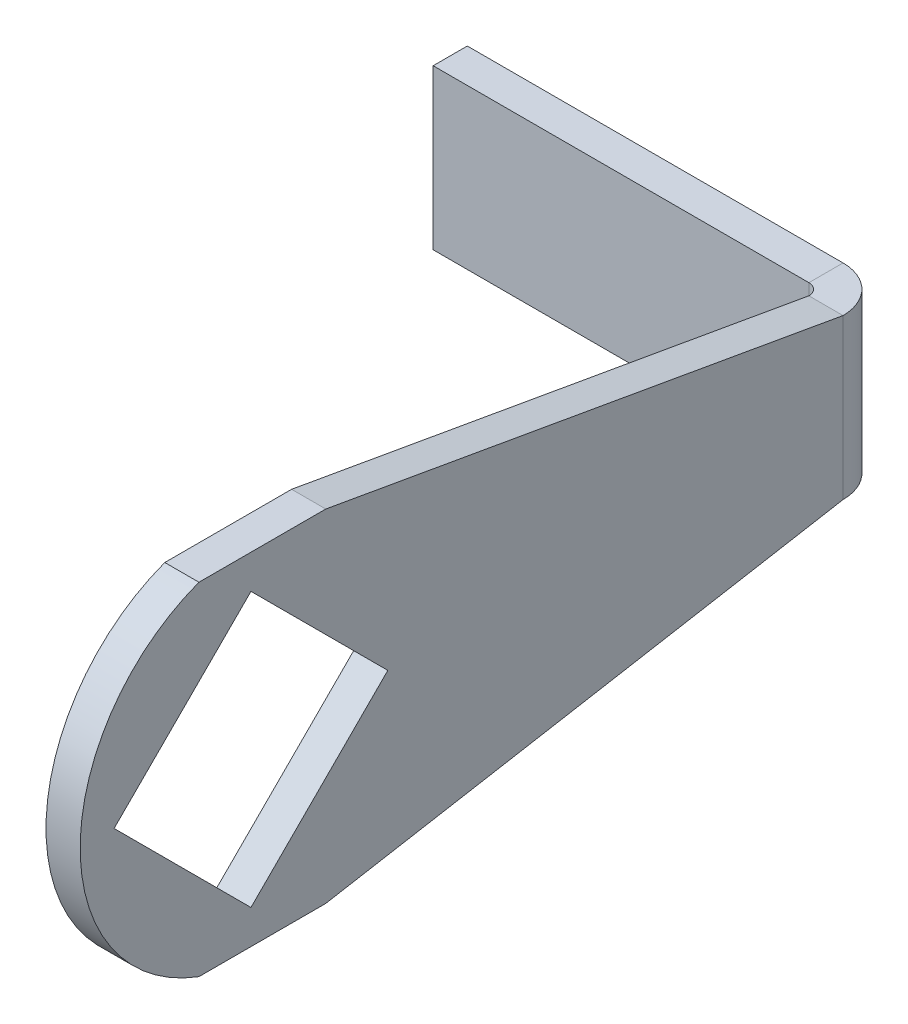
ISO-10303-21;
HEADER;
FILE_DESCRIPTION(('STEP AP214'),'2;1');
FILE_NAME('part.step','',(''),(''),'','','');
FILE_SCHEMA(('AUTOMOTIVE_DESIGN { 1 0 10303 214 1 1 1 1 }'));
ENDSEC;
DATA;
#1=APPLICATION_CONTEXT('core data for automotive mechanical design processes');
#2=APPLICATION_PROTOCOL_DEFINITION('international standard','automotive_design',2000,#1);
#3=PRODUCT_CONTEXT('',#1,'mechanical');
#4=PRODUCT('Part','Part','',(#3));
#5=PRODUCT_RELATED_PRODUCT_CATEGORY('part','',(#4));
#6=PRODUCT_DEFINITION_FORMATION('','',#4);
#7=PRODUCT_DEFINITION_CONTEXT('part definition',#1,'design');
#8=PRODUCT_DEFINITION('design','',#6,#7);
#9=PRODUCT_DEFINITION_SHAPE('','',#8);
#10=(LENGTH_UNIT() NAMED_UNIT(*) SI_UNIT(.MILLI.,.METRE.));
#11=(NAMED_UNIT(*) PLANE_ANGLE_UNIT() SI_UNIT($,.RADIAN.));
#12=(NAMED_UNIT(*) SI_UNIT($,.STERADIAN.) SOLID_ANGLE_UNIT());
#13=UNCERTAINTY_MEASURE_WITH_UNIT(LENGTH_MEASURE(1.E-05),#10,'distance_accuracy_value','');
#14=(GEOMETRIC_REPRESENTATION_CONTEXT(3) GLOBAL_UNCERTAINTY_ASSIGNED_CONTEXT((#13)) GLOBAL_UNIT_ASSIGNED_CONTEXT((#10,
#11,#12)) REPRESENTATION_CONTEXT('',''));
#15=CARTESIAN_POINT('',(0.,0.,0.));
#16=DIRECTION('',(0.,0.,1.));
#17=DIRECTION('',(1.,0.,0.));
#18=AXIS2_PLACEMENT_3D('',#15,#16,#17);
#19=CARTESIAN_POINT('',(9.99999999999999,7.50000000000001,1.49999999999999));
#20=DIRECTION('',(1.,0.,0.));
#21=DIRECTION('',(0.,0.,-1.));
#22=AXIS2_PLACEMENT_3D('',#19,#20,#21);
#23=PLANE('',#22);
#24=DIRECTION('',(0.,-0.70710678118654,0.707106781186555));
#25=VECTOR('',#24,1.);
#26=CARTESIAN_POINT('',(10.,20.0052038200427,14.0052038200424));
#27=LINE('',#26,#25);
#28=CARTESIAN_POINT('',(10.0000000000001,6.01040764008559,27.9999999999999));
#29=VERTEX_POINT('',#28);
#30=CARTESIAN_POINT('',(10.0000000000001,0.,34.0104076400856));
#31=VERTEX_POINT('',#30);
#32=EDGE_CURVE('E182',#29,#31,#27,.T.);
#33=ORIENTED_EDGE('',*,*,#32,.F.);
#34=DIRECTION('',(0.,0.707106781186544,0.707106781186551));
#35=VECTOR('',#34,1.);
#36=CARTESIAN_POINT('',(10.,-6.49479617995714,15.494796179957));
#37=LINE('',#36,#35);
#38=CARTESIAN_POINT('',(10.0000000000001,0.,21.9895923599142));
#39=VERTEX_POINT('',#38);
#40=EDGE_CURVE('E189',#39,#29,#37,.T.);
#41=ORIENTED_EDGE('',*,*,#40,.F.);
#42=DIRECTION('',(0.,0.707106781186544,-0.707106781186551));
#43=VECTOR('',#42,1.);
#44=CARTESIAN_POINT('',(10.,13.9947961799571,7.99479617995699));
#45=LINE('',#44,#43);
#46=CARTESIAN_POINT('',(10.0000000000001,-6.01040764008559,27.9999999999999));
#47=VERTEX_POINT('',#46);
#48=EDGE_CURVE('E186',#47,#39,#45,.T.);
#49=ORIENTED_EDGE('',*,*,#48,.F.);
#50=DIRECTION('',(0.,-0.70710678118654,-0.707106781186555));
#51=VECTOR('',#50,1.);
#52=CARTESIAN_POINT('',(10.0000000000001,-12.5052038200429,21.5052038200424));
#53=LINE('',#52,#51);
#54=EDGE_CURVE('E184',#31,#47,#53,.T.);
#55=ORIENTED_EDGE('',*,*,#54,.F.);
#56=EDGE_LOOP('',(#33,#41,#49,#55));
#57=FACE_BOUND('',#56,.T.);
#58=DIRECTION('',(0.,0.,1.));
#59=VECTOR('',#58,1.);
#60=CARTESIAN_POINT('',(10.0000000000001,-7.5,35.5));
#61=LINE('',#60,#59);
#62=CARTESIAN_POINT('',(10.0000000000001,-7.50000000000003,24.7161178185853));
#63=VERTEX_POINT('',#62);
#64=CARTESIAN_POINT('',(10.0000000000001,-7.5,30.2838821814149));
#65=VERTEX_POINT('',#64);
#66=EDGE_CURVE('E171',#63,#65,#61,.T.);
#67=ORIENTED_EDGE('',*,*,#66,.F.);
#68=DIRECTION('',(0.,0.1734184067972,-0.984848240179126));
#69=VECTOR('',#68,1.);
#70=CARTESIAN_POINT('',(9.99999999999999,-3.0837912116487,-0.363661968329762));
#71=LINE('',#70,#69);
#72=CARTESIAN_POINT('',(10.,-3.50000000000001,1.99999999999999));
#73=VERTEX_POINT('',#72);
#74=EDGE_CURVE('E153',#63,#73,#71,.T.);
#75=ORIENTED_EDGE('',*,*,#74,.T.);
#76=DIRECTION('',(0.,1.,0.));
#77=VECTOR('',#76,1.);
#78=CARTESIAN_POINT('',(10.,7.50000000000001,1.99999999999999));
#79=LINE('',#78,#77);
#80=CARTESIAN_POINT('',(10.,3.50000000000001,1.99999999999999));
#81=VERTEX_POINT('',#80);
#82=EDGE_CURVE('E177',#73,#81,#79,.T.);
#83=ORIENTED_EDGE('',*,*,#82,.T.);
#84=DIRECTION('',(0.,0.1734184067972,0.984848240179126));
#85=VECTOR('',#84,1.);
#86=CARTESIAN_POINT('',(10.,3.53490036888989,2.19820022290359));
#87=LINE('',#86,#85);
#88=CARTESIAN_POINT('',(10.0000000000001,7.5,24.7161178185849));
#89=VERTEX_POINT('',#88);
#90=EDGE_CURVE('E217',#81,#89,#87,.T.);
#91=ORIENTED_EDGE('',*,*,#90,.T.);
#92=DIRECTION('',(0.,0.,-1.));
#93=VECTOR('',#92,1.);
#94=CARTESIAN_POINT('',(9.99999999999999,7.50000000000001,1.49999999999999));
#95=LINE('',#94,#93);
#96=CARTESIAN_POINT('',(10.0000000000001,7.5,30.2838821814149));
#97=VERTEX_POINT('',#96);
#98=EDGE_CURVE('E167',#97,#89,#95,.T.);
#99=ORIENTED_EDGE('',*,*,#98,.F.);
#100=CARTESIAN_POINT('',(10.0000000000001,0.,27.4999999999999));
#101=DIRECTION('',(1.,0.,0.));
#102=DIRECTION('',(0.,0.,-1.));
#103=AXIS2_PLACEMENT_3D('',#100,#101,#102);
#104=CIRCLE('',#103,8.);
#105=EDGE_CURVE('E240',#97,#65,#104,.T.);
#106=ORIENTED_EDGE('',*,*,#105,.T.);
#107=EDGE_LOOP('',(#67,#75,#83,#91,#99,#106));
#108=FACE_BOUND('',#107,.T.);
#109=ADVANCED_FACE('F37',(#57,#108),#23,.T.);
#110=CARTESIAN_POINT('',(8.49999999999999,7.50000000000001,1.5));
#111=DIRECTION('',(1.,0.,0.));
#112=DIRECTION('',(0.,0.,-1.));
#113=AXIS2_PLACEMENT_3D('',#110,#111,#112);
#114=PLANE('',#113);
#115=DIRECTION('',(0.,-0.707106781186544,-0.707106781186551));
#116=VECTOR('',#115,1.);
#117=CARTESIAN_POINT('',(8.50000000000009,6.01040764008559,27.9999999999999));
#118=LINE('',#117,#116);
#119=CARTESIAN_POINT('',(8.50000000000009,6.01040764008559,27.9999999999998));
#120=VERTEX_POINT('',#119);
#121=CARTESIAN_POINT('',(8.50000000000006,0.,21.9895923599142));
#122=VERTEX_POINT('',#121);
#123=EDGE_CURVE('E206',#120,#122,#118,.T.);
#124=ORIENTED_EDGE('',*,*,#123,.F.);
#125=DIRECTION('',(0.,0.70710678118654,-0.707106781186555));
#126=VECTOR('',#125,1.);
#127=CARTESIAN_POINT('',(8.50000000000009,6.01040764008559,27.9999999999999));
#128=LINE('',#127,#126);
#129=CARTESIAN_POINT('',(8.50000000000011,0.,34.0104076400856));
#130=VERTEX_POINT('',#129);
#131=EDGE_CURVE('E209',#130,#120,#128,.T.);
#132=ORIENTED_EDGE('',*,*,#131,.F.);
#133=DIRECTION('',(0.,0.70710678118654,0.707106781186555));
#134=VECTOR('',#133,1.);
#135=CARTESIAN_POINT('',(8.50000000000009,-6.01040764008559,27.9999999999999));
#136=LINE('',#135,#134);
#137=CARTESIAN_POINT('',(8.50000000000009,-6.01040764008559,27.9999999999999));
#138=VERTEX_POINT('',#137);
#139=EDGE_CURVE('E196',#138,#130,#136,.T.);
#140=ORIENTED_EDGE('',*,*,#139,.F.);
#141=DIRECTION('',(0.,-0.707106781186544,0.707106781186551));
#142=VECTOR('',#141,1.);
#143=CARTESIAN_POINT('',(8.50000000000009,-6.01040764008559,27.9999999999999));
#144=LINE('',#143,#142);
#145=EDGE_CURVE('E203',#122,#138,#144,.T.);
#146=ORIENTED_EDGE('',*,*,#145,.F.);
#147=EDGE_LOOP('',(#124,#132,#140,#146));
#148=FACE_BOUND('',#147,.T.);
#149=DIRECTION('',(0.,0.1734184067972,-0.984848240179126));
#150=VECTOR('',#149,1.);
#151=CARTESIAN_POINT('',(8.49999999999999,-3.0837912116487,-0.363661968329757));
#152=LINE('',#151,#150);
#153=CARTESIAN_POINT('',(8.50000000000007,-7.50000000000003,24.7161178185853));
#154=VERTEX_POINT('',#153);
#155=CARTESIAN_POINT('',(8.5,-3.5,2.));
#156=VERTEX_POINT('',#155);
#157=EDGE_CURVE('E250',#154,#156,#152,.T.);
#158=ORIENTED_EDGE('',*,*,#157,.F.);
#159=DIRECTION('',(0.,0.,1.));
#160=VECTOR('',#159,1.);
#161=CARTESIAN_POINT('',(8.50000000000011,-7.5,35.5));
#162=LINE('',#161,#160);
#163=CARTESIAN_POINT('',(8.5000000000001,-7.5,30.283882181415));
#164=VERTEX_POINT('',#163);
#165=EDGE_CURVE('E176',#154,#164,#162,.T.);
#166=ORIENTED_EDGE('',*,*,#165,.T.);
#167=CARTESIAN_POINT('',(8.50000000000009,0.,27.4999999999999));
#168=DIRECTION('',(1.,0.,0.));
#169=DIRECTION('',(0.,0.,-1.));
#170=AXIS2_PLACEMENT_3D('',#167,#168,#169);
#171=CIRCLE('',#170,8.);
#172=CARTESIAN_POINT('',(8.50000000000009,7.5,30.2838821814149));
#173=VERTEX_POINT('',#172);
#174=EDGE_CURVE('E239',#173,#164,#171,.T.);
#175=ORIENTED_EDGE('',*,*,#174,.F.);
#176=DIRECTION('',(0.,0.,-1.));
#177=VECTOR('',#176,1.);
#178=CARTESIAN_POINT('',(8.49999999999999,7.50000000000001,1.5));
#179=LINE('',#178,#177);
#180=CARTESIAN_POINT('',(8.50000000000007,7.5,24.7161178185849));
#181=VERTEX_POINT('',#180);
#182=EDGE_CURVE('E174',#173,#181,#179,.T.);
#183=ORIENTED_EDGE('',*,*,#182,.T.);
#184=DIRECTION('',(0.,0.1734184067972,0.984848240179126));
#185=VECTOR('',#184,1.);
#186=CARTESIAN_POINT('',(8.5,3.53490036888989,2.1982002229036));
#187=LINE('',#186,#185);
#188=CARTESIAN_POINT('',(8.5,3.50000000000001,2.));
#189=VERTEX_POINT('',#188);
#190=EDGE_CURVE('E214',#189,#181,#187,.T.);
#191=ORIENTED_EDGE('',*,*,#190,.F.);
#192=DIRECTION('',(0.,1.,0.));
#193=VECTOR('',#192,1.);
#194=CARTESIAN_POINT('',(8.5,-7.5,2.));
#195=LINE('',#194,#193);
#196=EDGE_CURVE('E60',#156,#189,#195,.T.);
#197=ORIENTED_EDGE('',*,*,#196,.F.);
#198=EDGE_LOOP('',(#158,#166,#175,#183,#191,#197));
#199=FACE_BOUND('',#198,.T.);
#200=ADVANCED_FACE('F277',(#148,#199),#114,.F.);
#201=CARTESIAN_POINT('',(10.0000000000001,-7.5,35.5));
#202=DIRECTION('',(0.,-1.,0.));
#203=DIRECTION('',(0.,0.,-1.));
#204=AXIS2_PLACEMENT_3D('',#201,#202,#203);
#205=PLANE('',#204);
#206=ORIENTED_EDGE('',*,*,#165,.F.);
#207=DIRECTION('',(1.,0.,0.));
#208=VECTOR('',#207,1.);
#209=CARTESIAN_POINT('',(10.0000000000001,-7.50000000000003,24.7161178185853));
#210=LINE('',#209,#208);
#211=EDGE_CURVE('E248',#63,#154,#210,.F.);
#212=ORIENTED_EDGE('',*,*,#211,.F.);
#213=ORIENTED_EDGE('',*,*,#66,.T.);
#214=DIRECTION('',(1.,0.,0.));
#215=VECTOR('',#214,1.);
#216=CARTESIAN_POINT('',(10.0000000000001,-7.5,30.2838821814149));
#217=LINE('',#216,#215);
#218=EDGE_CURVE('E235',#65,#164,#217,.F.);
#219=ORIENTED_EDGE('',*,*,#218,.T.);
#220=EDGE_LOOP('',(#206,#212,#213,#219));
#221=FACE_BOUND('',#220,.T.);
#222=ADVANCED_FACE('F283',(#221),#205,.T.);
#223=CARTESIAN_POINT('',(-8.5,-7.5,1.5));
#224=DIRECTION('',(0.,0.,1.));
#225=DIRECTION('',(1.,0.,0.));
#226=AXIS2_PLACEMENT_3D('',#223,#224,#225);
#227=PLANE('',#226);
#228=DIRECTION('',(0.,-1.,0.));
#229=VECTOR('',#228,1.);
#230=CARTESIAN_POINT('',(-8.5,7.5,1.5));
#231=LINE('',#230,#229);
#232=CARTESIAN_POINT('',(-8.5,3.5,1.5));
#233=VERTEX_POINT('',#232);
#234=CARTESIAN_POINT('',(-8.5,-3.5,1.5));
#235=VERTEX_POINT('',#234);
#236=EDGE_CURVE('E11',#233,#235,#231,.T.);
#237=ORIENTED_EDGE('',*,*,#236,.T.);
#238=DIRECTION('',(1.,0.,0.));
#239=VECTOR('',#238,1.);
#240=CARTESIAN_POINT('',(-8.5,-3.5,1.5));
#241=LINE('',#240,#239);
#242=CARTESIAN_POINT('',(8.,-3.5,1.5));
#243=VERTEX_POINT('',#242);
#244=EDGE_CURVE('E150',#235,#243,#241,.T.);
#245=ORIENTED_EDGE('',*,*,#244,.T.);
#246=DIRECTION('',(0.,1.,0.));
#247=VECTOR('',#246,1.);
#248=CARTESIAN_POINT('',(8.,7.50000000000001,1.5));
#249=LINE('',#248,#247);
#250=CARTESIAN_POINT('',(8.,3.5,1.5));
#251=VERTEX_POINT('',#250);
#252=EDGE_CURVE('E160',#251,#243,#249,.F.);
#253=ORIENTED_EDGE('',*,*,#252,.F.);
#254=DIRECTION('',(-1.,0.,0.));
#255=VECTOR('',#254,1.);
#256=CARTESIAN_POINT('',(-8.5,3.5,1.5));
#257=LINE('',#256,#255);
#258=EDGE_CURVE('E229',#251,#233,#257,.T.);
#259=ORIENTED_EDGE('',*,*,#258,.T.);
#260=EDGE_LOOP('',(#237,#245,#253,#259));
#261=FACE_BOUND('',#260,.T.);
#262=ADVANCED_FACE('F158',(#261),#227,.T.);
#263=CARTESIAN_POINT('',(-8.5,-7.5,0.));
#264=DIRECTION('',(0.,0.,1.));
#265=DIRECTION('',(1.,0.,0.));
#266=AXIS2_PLACEMENT_3D('',#263,#264,#265);
#267=PLANE('',#266);
#268=DIRECTION('',(1.,0.,0.));
#269=VECTOR('',#268,1.);
#270=CARTESIAN_POINT('',(-45.5615862494977,-3.5,0.));
#271=LINE('',#270,#269);
#272=CARTESIAN_POINT('',(-8.5,-3.5,0.));
#273=VERTEX_POINT('',#272);
#274=CARTESIAN_POINT('',(8.,-3.5,0.));
#275=VERTEX_POINT('',#274);
#276=EDGE_CURVE('E144',#273,#275,#271,.T.);
#277=ORIENTED_EDGE('',*,*,#276,.F.);
#278=DIRECTION('',(0.,-1.,0.));
#279=VECTOR('',#278,1.);
#280=CARTESIAN_POINT('',(-8.5,7.5,0.));
#281=LINE('',#280,#279);
#282=CARTESIAN_POINT('',(-8.5,3.5,0.));
#283=VERTEX_POINT('',#282);
#284=EDGE_CURVE('E41',#283,#273,#281,.T.);
#285=ORIENTED_EDGE('',*,*,#284,.F.);
#286=DIRECTION('',(1.,0.,0.));
#287=VECTOR('',#286,1.);
#288=CARTESIAN_POINT('',(-8.5,3.5,0.));
#289=LINE('',#288,#287);
#290=CARTESIAN_POINT('',(8.,3.5,0.));
#291=VERTEX_POINT('',#290);
#292=EDGE_CURVE('E226',#291,#283,#289,.F.);
#293=ORIENTED_EDGE('',*,*,#292,.F.);
#294=DIRECTION('',(0.,1.,0.));
#295=VECTOR('',#294,1.);
#296=CARTESIAN_POINT('',(8.,7.50000000000001,0.));
#297=LINE('',#296,#295);
#298=EDGE_CURVE('E166',#291,#275,#297,.F.);
#299=ORIENTED_EDGE('',*,*,#298,.T.);
#300=EDGE_LOOP('',(#277,#285,#293,#299));
#301=FACE_BOUND('',#300,.T.);
#302=ADVANCED_FACE('F263',(#301),#267,.F.);
#303=CARTESIAN_POINT('',(-8.5,7.5,1.5));
#304=DIRECTION('',(1.,0.,0.));
#305=DIRECTION('',(0.,0.,-1.));
#306=AXIS2_PLACEMENT_3D('',#303,#304,#305);
#307=PLANE('',#306);
#308=DIRECTION('',(0.,0.,-1.));
#309=VECTOR('',#308,1.);
#310=CARTESIAN_POINT('',(-8.5,-3.5,0.));
#311=LINE('',#310,#309);
#312=EDGE_CURVE('E154',#273,#235,#311,.F.);
#313=ORIENTED_EDGE('',*,*,#312,.T.);
#314=ORIENTED_EDGE('',*,*,#236,.F.);
#315=DIRECTION('',(0.,0.,1.));
#316=VECTOR('',#315,1.);
#317=CARTESIAN_POINT('',(-8.5,3.5,1.5));
#318=LINE('',#317,#316);
#319=EDGE_CURVE('E220',#233,#283,#318,.F.);
#320=ORIENTED_EDGE('',*,*,#319,.T.);
#321=ORIENTED_EDGE('',*,*,#284,.T.);
#322=EDGE_LOOP('',(#313,#314,#320,#321));
#323=FACE_BOUND('',#322,.T.);
#324=ADVANCED_FACE('F39',(#323),#307,.F.);
#325=CARTESIAN_POINT('',(8.,7.50000000000001,2.));
#326=DIRECTION('',(0.,1.,0.));
#327=DIRECTION('',(1.,0.,0.));
#328=AXIS2_PLACEMENT_3D('',#325,#326,#327);
#329=CYLINDRICAL_SURFACE('',#328,2.);
#330=ORIENTED_EDGE('',*,*,#82,.F.);
#331=CARTESIAN_POINT('',(8.,-3.5,2.));
#332=DIRECTION('',(0.,-1.,0.));
#333=DIRECTION('',(0.,0.,-1.));
#334=AXIS2_PLACEMENT_3D('',#331,#332,#333);
#335=CIRCLE('',#334,2.);
#336=EDGE_CURVE('E145',#73,#275,#335,.F.);
#337=ORIENTED_EDGE('',*,*,#336,.T.);
#338=ORIENTED_EDGE('',*,*,#298,.F.);
#339=CARTESIAN_POINT('',(8.,3.5,2.));
#340=DIRECTION('',(0.,1.,0.));
#341=DIRECTION('',(0.,0.,1.));
#342=AXIS2_PLACEMENT_3D('',#339,#340,#341);
#343=CIRCLE('',#342,2.);
#344=EDGE_CURVE('E232',#291,#81,#343,.F.);
#345=ORIENTED_EDGE('',*,*,#344,.T.);
#346=EDGE_LOOP('',(#330,#337,#338,#345));
#347=FACE_BOUND('',#346,.T.);
#348=ADVANCED_FACE('F260',(#347),#329,.T.);
#349=CARTESIAN_POINT('',(8.,7.50000000000001,2.));
#350=DIRECTION('',(0.,1.,0.));
#351=DIRECTION('',(1.,0.,0.));
#352=AXIS2_PLACEMENT_3D('',#349,#350,#351);
#353=CYLINDRICAL_SURFACE('',#352,0.5);
#354=CARTESIAN_POINT('',(8.,-3.50000000000001,2.));
#355=DIRECTION('',(0.,1.,0.));
#356=DIRECTION('',(0.,0.,1.));
#357=AXIS2_PLACEMENT_3D('',#354,#355,#356);
#358=CIRCLE('',#357,0.5);
#359=EDGE_CURVE('E138',#156,#243,#358,.T.);
#360=ORIENTED_EDGE('',*,*,#359,.F.);
#361=ORIENTED_EDGE('',*,*,#196,.T.);
#362=CARTESIAN_POINT('',(8.,3.5,2.));
#363=DIRECTION('',(0.,1.,0.));
#364=DIRECTION('',(0.,0.,1.));
#365=AXIS2_PLACEMENT_3D('',#362,#363,#364);
#366=CIRCLE('',#365,0.5);
#367=EDGE_CURVE('E165',#251,#189,#366,.F.);
#368=ORIENTED_EDGE('',*,*,#367,.F.);
#369=ORIENTED_EDGE('',*,*,#252,.T.);
#370=EDGE_LOOP('',(#360,#361,#368,#369));
#371=FACE_BOUND('',#370,.T.);
#372=ADVANCED_FACE('F163',(#371),#353,.F.);
#373=CARTESIAN_POINT('',(9.99999999999999,7.50000000000001,1.49999999999999));
#374=DIRECTION('',(0.,1.,0.));
#375=DIRECTION('',(0.,0.,1.));
#376=AXIS2_PLACEMENT_3D('',#373,#374,#375);
#377=PLANE('',#376);
#378=ORIENTED_EDGE('',*,*,#182,.F.);
#379=DIRECTION('',(-1.,0.,0.));
#380=VECTOR('',#379,1.);
#381=CARTESIAN_POINT('',(8.50000000000009,7.5,30.2838821814149));
#382=LINE('',#381,#380);
#383=EDGE_CURVE('E243',#173,#97,#382,.F.);
#384=ORIENTED_EDGE('',*,*,#383,.T.);
#385=ORIENTED_EDGE('',*,*,#98,.T.);
#386=DIRECTION('',(1.,0.,0.));
#387=VECTOR('',#386,1.);
#388=CARTESIAN_POINT('',(10.0000000000001,7.5,24.7161178185849));
#389=LINE('',#388,#387);
#390=EDGE_CURVE('E211',#89,#181,#389,.F.);
#391=ORIENTED_EDGE('',*,*,#390,.T.);
#392=EDGE_LOOP('',(#378,#384,#385,#391));
#393=FACE_BOUND('',#392,.T.);
#394=ADVANCED_FACE('F292',(#393),#377,.T.);
#395=CARTESIAN_POINT('',(10.5000000000001,6.01040764008559,27.9999999999998));
#396=DIRECTION('',(0.,0.707106781186555,0.70710678118654));
#397=DIRECTION('',(0.,-0.70710678118654,0.707106781186555));
#398=AXIS2_PLACEMENT_3D('',#395,#396,#397);
#399=PLANE('',#398);
#400=ORIENTED_EDGE('',*,*,#32,.T.);
#401=DIRECTION('',(-1.,0.,0.));
#402=VECTOR('',#401,1.);
#403=CARTESIAN_POINT('',(10.5000000000001,0.,34.0104076400856));
#404=LINE('',#403,#402);
#405=EDGE_CURVE('E191',#31,#130,#404,.T.);
#406=ORIENTED_EDGE('',*,*,#405,.T.);
#407=ORIENTED_EDGE('',*,*,#131,.T.);
#408=DIRECTION('',(-1.,0.,0.));
#409=VECTOR('',#408,1.);
#410=CARTESIAN_POINT('',(10.5000000000001,6.01040764008559,27.9999999999998));
#411=LINE('',#410,#409);
#412=EDGE_CURVE('E192',#29,#120,#411,.T.);
#413=ORIENTED_EDGE('',*,*,#412,.F.);
#414=EDGE_LOOP('',(#400,#406,#407,#413));
#415=FACE_BOUND('',#414,.T.);
#416=ADVANCED_FACE('F289',(#415),#399,.F.);
#417=CARTESIAN_POINT('',(10.5000000000001,-6.01040764008559,27.9999999999998));
#418=DIRECTION('',(0.,-0.707106781186555,0.70710678118654));
#419=DIRECTION('',(0.,-0.70710678118654,-0.707106781186555));
#420=AXIS2_PLACEMENT_3D('',#417,#418,#419);
#421=PLANE('',#420);
#422=ORIENTED_EDGE('',*,*,#54,.T.);
#423=DIRECTION('',(-1.,0.,0.));
#424=VECTOR('',#423,1.);
#425=CARTESIAN_POINT('',(10.5000000000001,-6.01040764008559,27.9999999999998));
#426=LINE('',#425,#424);
#427=EDGE_CURVE('E198',#47,#138,#426,.T.);
#428=ORIENTED_EDGE('',*,*,#427,.T.);
#429=ORIENTED_EDGE('',*,*,#139,.T.);
#430=ORIENTED_EDGE('',*,*,#405,.F.);
#431=EDGE_LOOP('',(#422,#428,#429,#430));
#432=FACE_BOUND('',#431,.T.);
#433=ADVANCED_FACE('F464',(#432),#421,.F.);
#434=CARTESIAN_POINT('',(10.5000000000001,-6.01040764008559,27.9999999999998));
#435=DIRECTION('',(0.,-0.707106781186551,-0.707106781186544));
#436=DIRECTION('',(0.,0.707106781186544,-0.707106781186551));
#437=AXIS2_PLACEMENT_3D('',#434,#435,#436);
#438=PLANE('',#437);
#439=ORIENTED_EDGE('',*,*,#48,.T.);
#440=DIRECTION('',(-1.,0.,0.));
#441=VECTOR('',#440,1.);
#442=CARTESIAN_POINT('',(10.5000000000001,0.,21.9895923599142));
#443=LINE('',#442,#441);
#444=EDGE_CURVE('E195',#39,#122,#443,.T.);
#445=ORIENTED_EDGE('',*,*,#444,.T.);
#446=ORIENTED_EDGE('',*,*,#145,.T.);
#447=ORIENTED_EDGE('',*,*,#427,.F.);
#448=EDGE_LOOP('',(#439,#445,#446,#447));
#449=FACE_BOUND('',#448,.T.);
#450=ADVANCED_FACE('F454',(#449),#438,.F.);
#451=CARTESIAN_POINT('',(10.5000000000001,6.01040764008559,27.9999999999998));
#452=DIRECTION('',(0.,0.707106781186551,-0.707106781186544));
#453=DIRECTION('',(0.,0.707106781186544,0.707106781186551));
#454=AXIS2_PLACEMENT_3D('',#451,#452,#453);
#455=PLANE('',#454);
#456=ORIENTED_EDGE('',*,*,#40,.T.);
#457=ORIENTED_EDGE('',*,*,#412,.T.);
#458=ORIENTED_EDGE('',*,*,#123,.T.);
#459=ORIENTED_EDGE('',*,*,#444,.F.);
#460=EDGE_LOOP('',(#456,#457,#458,#459));
#461=FACE_BOUND('',#460,.T.);
#462=ADVANCED_FACE('F348',(#461),#455,.F.);
#463=CARTESIAN_POINT('',(10.,3.53490036888989,2.19820022290359));
#464=DIRECTION('',(0.,0.984848240179126,-0.1734184067972));
#465=DIRECTION('',(0.,0.1734184067972,0.984848240179126));
#466=AXIS2_PLACEMENT_3D('',#463,#464,#465);
#467=PLANE('',#466);
#468=ORIENTED_EDGE('',*,*,#390,.F.);
#469=ORIENTED_EDGE('',*,*,#90,.F.);
#470=DIRECTION('',(1.,0.,0.));
#471=VECTOR('',#470,1.);
#472=CARTESIAN_POINT('',(10.,3.50000000000001,1.99999999999999));
#473=LINE('',#472,#471);
#474=EDGE_CURVE('E212',#81,#189,#473,.F.);
#475=ORIENTED_EDGE('',*,*,#474,.T.);
#476=ORIENTED_EDGE('',*,*,#190,.T.);
#477=EDGE_LOOP('',(#468,#469,#475,#476));
#478=FACE_BOUND('',#477,.T.);
#479=ADVANCED_FACE('F343',(#478),#467,.T.);
#480=CARTESIAN_POINT('',(-8.5,3.5,1.5));
#481=DIRECTION('',(0.,1.,0.));
#482=DIRECTION('',(-1.,0.,0.));
#483=AXIS2_PLACEMENT_3D('',#480,#481,#482);
#484=PLANE('',#483);
#485=ORIENTED_EDGE('',*,*,#319,.F.);
#486=ORIENTED_EDGE('',*,*,#258,.F.);
#487=DIRECTION('',(0.,0.,1.));
#488=VECTOR('',#487,1.);
#489=CARTESIAN_POINT('',(8.,3.5,1.5));
#490=LINE('',#489,#488);
#491=EDGE_CURVE('E223',#251,#291,#490,.F.);
#492=ORIENTED_EDGE('',*,*,#491,.T.);
#493=ORIENTED_EDGE('',*,*,#292,.T.);
#494=EDGE_LOOP('',(#485,#486,#492,#493));
#495=FACE_BOUND('',#494,.T.);
#496=ADVANCED_FACE('F267',(#495),#484,.T.);
#497=CARTESIAN_POINT('',(8.,3.5,2.));
#498=DIRECTION('',(0.,-1.,0.));
#499=DIRECTION('',(0.,0.,-1.));
#500=AXIS2_PLACEMENT_3D('',#497,#498,#499);
#501=PLANE('',#500);
#502=ORIENTED_EDGE('',*,*,#474,.F.);
#503=ORIENTED_EDGE('',*,*,#344,.F.);
#504=ORIENTED_EDGE('',*,*,#491,.F.);
#505=ORIENTED_EDGE('',*,*,#367,.T.);
#506=EDGE_LOOP('',(#502,#503,#504,#505));
#507=FACE_BOUND('',#506,.T.);
#508=ADVANCED_FACE('F361',(#507),#501,.F.);
#509=CARTESIAN_POINT('',(10.0000000000001,0.,27.4999999999999));
#510=DIRECTION('',(1.,0.,0.));
#511=DIRECTION('',(0.,0.,-1.));
#512=AXIS2_PLACEMENT_3D('',#509,#510,#511);
#513=CYLINDRICAL_SURFACE('',#512,8.);
#514=ORIENTED_EDGE('',*,*,#218,.F.);
#515=ORIENTED_EDGE('',*,*,#105,.F.);
#516=ORIENTED_EDGE('',*,*,#383,.F.);
#517=ORIENTED_EDGE('',*,*,#174,.T.);
#518=EDGE_LOOP('',(#514,#515,#516,#517));
#519=FACE_BOUND('',#518,.T.);
#520=ADVANCED_FACE('F371',(#519),#513,.T.);
#521=CARTESIAN_POINT('',(9.99999999999999,-3.0837912116487,-0.363661968329762));
#522=DIRECTION('',(0.,-0.984848240179126,-0.1734184067972));
#523=DIRECTION('',(0.,0.1734184067972,-0.984848240179126));
#524=AXIS2_PLACEMENT_3D('',#521,#522,#523);
#525=PLANE('',#524);
#526=DIRECTION('',(1.,0.,0.));
#527=VECTOR('',#526,1.);
#528=CARTESIAN_POINT('',(10.,-3.50000000000001,1.99999999999999));
#529=LINE('',#528,#527);
#530=EDGE_CURVE('E52',#73,#156,#529,.F.);
#531=ORIENTED_EDGE('',*,*,#530,.F.);
#532=ORIENTED_EDGE('',*,*,#74,.F.);
#533=ORIENTED_EDGE('',*,*,#211,.T.);
#534=ORIENTED_EDGE('',*,*,#157,.T.);
#535=EDGE_LOOP('',(#531,#532,#533,#534));
#536=FACE_BOUND('',#535,.T.);
#537=ADVANCED_FACE('F383',(#536),#525,.T.);
#538=CARTESIAN_POINT('',(-45.5615862494977,-3.5,0.));
#539=DIRECTION('',(0.,-1.,0.));
#540=DIRECTION('',(1.,0.,0.));
#541=AXIS2_PLACEMENT_3D('',#538,#539,#540);
#542=PLANE('',#541);
#543=ORIENTED_EDGE('',*,*,#276,.T.);
#544=DIRECTION('',(0.,0.,-1.));
#545=VECTOR('',#544,1.);
#546=CARTESIAN_POINT('',(8.,-3.5,0.));
#547=LINE('',#546,#545);
#548=EDGE_CURVE('E141',#275,#243,#547,.F.);
#549=ORIENTED_EDGE('',*,*,#548,.T.);
#550=ORIENTED_EDGE('',*,*,#244,.F.);
#551=ORIENTED_EDGE('',*,*,#312,.F.);
#552=EDGE_LOOP('',(#543,#549,#550,#551));
#553=FACE_BOUND('',#552,.T.);
#554=ADVANCED_FACE('F149',(#553),#542,.T.);
#555=CARTESIAN_POINT('',(8.,-3.5,2.));
#556=DIRECTION('',(0.,1.,0.));
#557=DIRECTION('',(0.,0.,1.));
#558=AXIS2_PLACEMENT_3D('',#555,#556,#557);
#559=PLANE('',#558);
#560=ORIENTED_EDGE('',*,*,#548,.F.);
#561=ORIENTED_EDGE('',*,*,#336,.F.);
#562=ORIENTED_EDGE('',*,*,#530,.T.);
#563=ORIENTED_EDGE('',*,*,#359,.T.);
#564=EDGE_LOOP('',(#560,#561,#562,#563));
#565=FACE_BOUND('',#564,.T.);
#566=ADVANCED_FACE('F140',(#565),#559,.F.);
#567=CLOSED_SHELL('',(#109,#200,#222,#262,#302,#324,#348,#372,#394,#416,#433,#450,#462,#479,
#496,#508,#520,#537,#554,#566));
#568=MANIFOLD_SOLID_BREP('B2',#567);
#569=ADVANCED_BREP_SHAPE_REPRESENTATION('',(#18,#568),#14);
#570=SHAPE_DEFINITION_REPRESENTATION(#9,#569);
ENDSEC;
END-ISO-10303-21;
